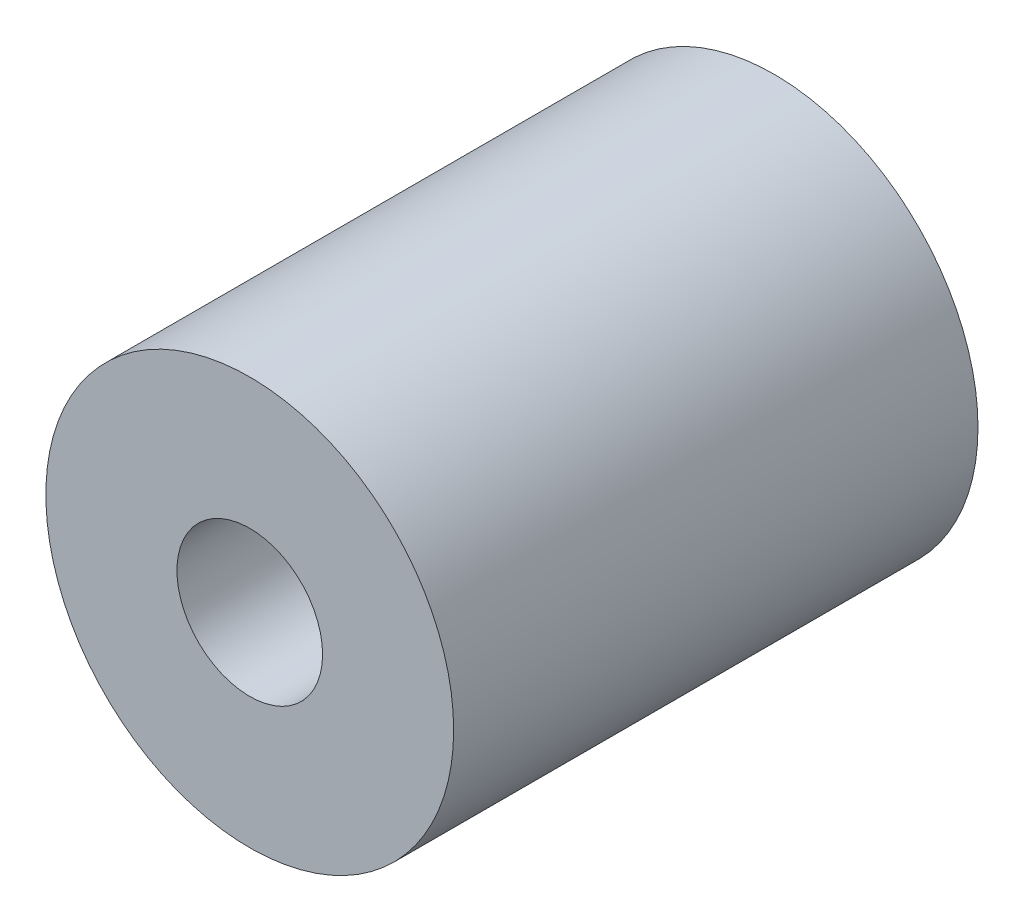
ISO-10303-21;
HEADER;
FILE_DESCRIPTION(('STEP AP214'),'2;1');
FILE_NAME('part.step','',(''),(''),'','','');
FILE_SCHEMA(('AUTOMOTIVE_DESIGN { 1 0 10303 214 1 1 1 1 }'));
ENDSEC;
DATA;
#1=APPLICATION_CONTEXT('core data for automotive mechanical design processes');
#2=APPLICATION_PROTOCOL_DEFINITION('international standard','automotive_design',2000,#1);
#3=PRODUCT_CONTEXT('',#1,'mechanical');
#4=PRODUCT('Part','Part','',(#3));
#5=PRODUCT_RELATED_PRODUCT_CATEGORY('part','',(#4));
#6=PRODUCT_DEFINITION_FORMATION('','',#4);
#7=PRODUCT_DEFINITION_CONTEXT('part definition',#1,'design');
#8=PRODUCT_DEFINITION('design','',#6,#7);
#9=PRODUCT_DEFINITION_SHAPE('','',#8);
#10=(LENGTH_UNIT() NAMED_UNIT(*) SI_UNIT(.MILLI.,.METRE.));
#11=(NAMED_UNIT(*) PLANE_ANGLE_UNIT() SI_UNIT($,.RADIAN.));
#12=(NAMED_UNIT(*) SI_UNIT($,.STERADIAN.) SOLID_ANGLE_UNIT());
#13=UNCERTAINTY_MEASURE_WITH_UNIT(LENGTH_MEASURE(1.E-05),#10,'distance_accuracy_value','');
#14=(GEOMETRIC_REPRESENTATION_CONTEXT(3) GLOBAL_UNCERTAINTY_ASSIGNED_CONTEXT((#13)) GLOBAL_UNIT_ASSIGNED_CONTEXT((#10,
#11,#12)) REPRESENTATION_CONTEXT('',''));
#15=CARTESIAN_POINT('',(0.,0.,0.));
#16=DIRECTION('',(0.,0.,1.));
#17=DIRECTION('',(1.,0.,0.));
#18=AXIS2_PLACEMENT_3D('',#15,#16,#17);
#19=CARTESIAN_POINT('',(0.,0.,0.));
#20=DIRECTION('',(0.,0.,1.));
#21=DIRECTION('',(1.,0.,0.));
#22=AXIS2_PLACEMENT_3D('',#19,#20,#21);
#23=PLANE('',#22);
#24=CARTESIAN_POINT('',(0.,0.,0.));
#25=DIRECTION('',(0.,0.,1.));
#26=DIRECTION('',(1.,0.,0.));
#27=AXIS2_PLACEMENT_3D('',#24,#25,#26);
#28=CIRCLE('',#27,7.);
#29=CARTESIAN_POINT('',(7.,0.,0.));
#30=VERTEX_POINT('',#29);
#31=EDGE_CURVE('E11',#30,#30,#28,.T.);
#32=ORIENTED_EDGE('',*,*,#31,.F.);
#33=EDGE_LOOP('',(#32));
#34=FACE_BOUND('',#33,.T.);
#35=DIRECTION('',(1.,0.,0.));
#36=VECTOR('',#35,1.);
#37=CARTESIAN_POINT('',(-2.28053356329902,-3.95,0.));
#38=LINE('',#37,#36);
#39=CARTESIAN_POINT('',(-2.28053356329902,-3.95,0.));
#40=VERTEX_POINT('',#39);
#41=CARTESIAN_POINT('',(2.28053356329902,-3.95,0.));
#42=VERTEX_POINT('',#41);
#43=EDGE_CURVE('E48',#40,#42,#38,.T.);
#44=ORIENTED_EDGE('',*,*,#43,.T.);
#45=DIRECTION('',(0.5,0.866025403784439,0.));
#46=VECTOR('',#45,1.);
#47=CARTESIAN_POINT('',(2.28053356329902,-3.95,0.));
#48=LINE('',#47,#46);
#49=CARTESIAN_POINT('',(4.56106712659804,0.,0.));
#50=VERTEX_POINT('',#49);
#51=EDGE_CURVE('E107',#42,#50,#48,.T.);
#52=ORIENTED_EDGE('',*,*,#51,.T.);
#53=DIRECTION('',(-0.5,0.866025403784439,0.));
#54=VECTOR('',#53,1.);
#55=CARTESIAN_POINT('',(4.56106712659804,0.,0.));
#56=LINE('',#55,#54);
#57=CARTESIAN_POINT('',(2.28053356329902,3.95,0.));
#58=VERTEX_POINT('',#57);
#59=EDGE_CURVE('E105',#50,#58,#56,.T.);
#60=ORIENTED_EDGE('',*,*,#59,.T.);
#61=DIRECTION('',(-1.,0.,0.));
#62=VECTOR('',#61,1.);
#63=CARTESIAN_POINT('',(2.28053356329902,3.95,0.));
#64=LINE('',#63,#62);
#65=CARTESIAN_POINT('',(-2.28053356329902,3.95,0.));
#66=VERTEX_POINT('',#65);
#67=EDGE_CURVE('E84',#58,#66,#64,.T.);
#68=ORIENTED_EDGE('',*,*,#67,.T.);
#69=DIRECTION('',(-0.5,-0.866025403784439,0.));
#70=VECTOR('',#69,1.);
#71=CARTESIAN_POINT('',(-2.28053356329902,3.95,0.));
#72=LINE('',#71,#70);
#73=CARTESIAN_POINT('',(-4.56106712659804,0.,0.));
#74=VERTEX_POINT('',#73);
#75=EDGE_CURVE('E95',#66,#74,#72,.T.);
#76=ORIENTED_EDGE('',*,*,#75,.T.);
#77=DIRECTION('',(0.5,-0.866025403784439,0.));
#78=VECTOR('',#77,1.);
#79=CARTESIAN_POINT('',(-4.56106712659804,0.,0.));
#80=LINE('',#79,#78);
#81=EDGE_CURVE('E101',#74,#40,#80,.T.);
#82=ORIENTED_EDGE('',*,*,#81,.T.);
#83=EDGE_LOOP('',(#44,#52,#60,#68,#76,#82));
#84=FACE_BOUND('',#83,.T.);
#85=ADVANCED_FACE('F33',(#34,#84),#23,.F.);
#86=CARTESIAN_POINT('',(0.,0.,8.));
#87=DIRECTION('',(0.,0.,-1.));
#88=DIRECTION('',(-1.,0.,0.));
#89=AXIS2_PLACEMENT_3D('',#86,#87,#88);
#90=CYLINDRICAL_SURFACE('',#89,7.);
#91=ORIENTED_EDGE('',*,*,#31,.T.);
#92=EDGE_LOOP('',(#91));
#93=FACE_BOUND('',#92,.T.);
#94=CARTESIAN_POINT('',(0.,0.,18.));
#95=DIRECTION('',(0.,0.,1.));
#96=DIRECTION('',(1.,0.,0.));
#97=AXIS2_PLACEMENT_3D('',#94,#95,#96);
#98=CIRCLE('',#97,7.);
#99=CARTESIAN_POINT('',(7.,0.,18.));
#100=VERTEX_POINT('',#99);
#101=EDGE_CURVE('E122',#100,#100,#98,.T.);
#102=ORIENTED_EDGE('',*,*,#101,.F.);
#103=EDGE_LOOP('',(#102));
#104=FACE_BOUND('',#103,.T.);
#105=ADVANCED_FACE('F35',(#93,#104),#90,.T.);
#106=CARTESIAN_POINT('',(-2.28053356329902,-3.95,8.));
#107=DIRECTION('',(0.,1.,0.));
#108=DIRECTION('',(-1.,0.,0.));
#109=AXIS2_PLACEMENT_3D('',#106,#107,#108);
#110=PLANE('',#109);
#111=ORIENTED_EDGE('',*,*,#43,.F.);
#112=DIRECTION('',(0.,0.,-1.));
#113=VECTOR('',#112,1.);
#114=CARTESIAN_POINT('',(-2.28053356329902,-3.95,8.));
#115=LINE('',#114,#113);
#116=CARTESIAN_POINT('',(-2.28053356329902,-3.95,8.));
#117=VERTEX_POINT('',#116);
#118=EDGE_CURVE('E112',#117,#40,#115,.T.);
#119=ORIENTED_EDGE('',*,*,#118,.F.);
#120=DIRECTION('',(1.,0.,0.));
#121=VECTOR('',#120,1.);
#122=CARTESIAN_POINT('',(-2.28053356329902,-3.95,8.));
#123=LINE('',#122,#121);
#124=CARTESIAN_POINT('',(2.28053356329902,-3.95,8.));
#125=VERTEX_POINT('',#124);
#126=EDGE_CURVE('E57',#117,#125,#123,.T.);
#127=ORIENTED_EDGE('',*,*,#126,.T.);
#128=DIRECTION('',(0.,0.,-1.));
#129=VECTOR('',#128,1.);
#130=CARTESIAN_POINT('',(2.28053356329902,-3.95,8.));
#131=LINE('',#130,#129);
#132=EDGE_CURVE('E41',#125,#42,#131,.T.);
#133=ORIENTED_EDGE('',*,*,#132,.T.);
#134=EDGE_LOOP('',(#111,#119,#127,#133));
#135=FACE_BOUND('',#134,.T.);
#136=ADVANCED_FACE('F119',(#135),#110,.T.);
#137=CARTESIAN_POINT('',(2.28053356329902,-3.95,8.));
#138=DIRECTION('',(-0.866025403784439,0.5,0.));
#139=DIRECTION('',(-0.5,-0.866025403784439,0.));
#140=AXIS2_PLACEMENT_3D('',#137,#138,#139);
#141=PLANE('',#140);
#142=ORIENTED_EDGE('',*,*,#51,.F.);
#143=ORIENTED_EDGE('',*,*,#132,.F.);
#144=DIRECTION('',(0.5,0.866025403784439,0.));
#145=VECTOR('',#144,1.);
#146=CARTESIAN_POINT('',(2.28053356329902,-3.95,8.));
#147=LINE('',#146,#145);
#148=CARTESIAN_POINT('',(4.56106712659804,0.,8.));
#149=VERTEX_POINT('',#148);
#150=EDGE_CURVE('E135',#125,#149,#147,.T.);
#151=ORIENTED_EDGE('',*,*,#150,.T.);
#152=DIRECTION('',(0.,0.,-1.));
#153=VECTOR('',#152,1.);
#154=CARTESIAN_POINT('',(4.56106712659804,0.,8.));
#155=LINE('',#154,#153);
#156=EDGE_CURVE('E117',#149,#50,#155,.T.);
#157=ORIENTED_EDGE('',*,*,#156,.T.);
#158=EDGE_LOOP('',(#142,#143,#151,#157));
#159=FACE_BOUND('',#158,.T.);
#160=ADVANCED_FACE('F171',(#159),#141,.T.);
#161=CARTESIAN_POINT('',(4.56106712659804,0.,8.));
#162=DIRECTION('',(-0.866025403784439,-0.5,0.));
#163=DIRECTION('',(0.5,-0.866025403784439,0.));
#164=AXIS2_PLACEMENT_3D('',#161,#162,#163);
#165=PLANE('',#164);
#166=ORIENTED_EDGE('',*,*,#59,.F.);
#167=ORIENTED_EDGE('',*,*,#156,.F.);
#168=DIRECTION('',(-0.5,0.866025403784439,0.));
#169=VECTOR('',#168,1.);
#170=CARTESIAN_POINT('',(4.56106712659804,0.,8.));
#171=LINE('',#170,#169);
#172=CARTESIAN_POINT('',(2.28053356329902,3.95,8.));
#173=VERTEX_POINT('',#172);
#174=EDGE_CURVE('E132',#149,#173,#171,.T.);
#175=ORIENTED_EDGE('',*,*,#174,.T.);
#176=DIRECTION('',(0.,0.,-1.));
#177=VECTOR('',#176,1.);
#178=CARTESIAN_POINT('',(2.28053356329902,3.95,8.));
#179=LINE('',#178,#177);
#180=EDGE_CURVE('E91',#173,#58,#179,.T.);
#181=ORIENTED_EDGE('',*,*,#180,.T.);
#182=EDGE_LOOP('',(#166,#167,#175,#181));
#183=FACE_BOUND('',#182,.T.);
#184=ADVANCED_FACE('F174',(#183),#165,.T.);
#185=CARTESIAN_POINT('',(2.28053356329902,3.95,8.));
#186=DIRECTION('',(0.,-1.,0.));
#187=DIRECTION('',(1.,0.,0.));
#188=AXIS2_PLACEMENT_3D('',#185,#186,#187);
#189=PLANE('',#188);
#190=ORIENTED_EDGE('',*,*,#67,.F.);
#191=ORIENTED_EDGE('',*,*,#180,.F.);
#192=DIRECTION('',(-1.,0.,0.));
#193=VECTOR('',#192,1.);
#194=CARTESIAN_POINT('',(2.28053356329902,3.95,8.));
#195=LINE('',#194,#193);
#196=CARTESIAN_POINT('',(-2.28053356329902,3.95,8.));
#197=VERTEX_POINT('',#196);
#198=EDGE_CURVE('E88',#173,#197,#195,.T.);
#199=ORIENTED_EDGE('',*,*,#198,.T.);
#200=DIRECTION('',(0.,0.,-1.));
#201=VECTOR('',#200,1.);
#202=CARTESIAN_POINT('',(-2.28053356329902,3.95,8.));
#203=LINE('',#202,#201);
#204=EDGE_CURVE('E79',#197,#66,#203,.T.);
#205=ORIENTED_EDGE('',*,*,#204,.T.);
#206=EDGE_LOOP('',(#190,#191,#199,#205));
#207=FACE_BOUND('',#206,.T.);
#208=ADVANCED_FACE('F81',(#207),#189,.T.);
#209=CARTESIAN_POINT('',(-2.28053356329902,3.95,8.));
#210=DIRECTION('',(0.866025403784439,-0.5,0.));
#211=DIRECTION('',(0.5,0.866025403784439,0.));
#212=AXIS2_PLACEMENT_3D('',#209,#210,#211);
#213=PLANE('',#212);
#214=ORIENTED_EDGE('',*,*,#75,.F.);
#215=ORIENTED_EDGE('',*,*,#204,.F.);
#216=DIRECTION('',(-0.5,-0.866025403784439,0.));
#217=VECTOR('',#216,1.);
#218=CARTESIAN_POINT('',(-2.28053356329902,3.95,8.));
#219=LINE('',#218,#217);
#220=CARTESIAN_POINT('',(-4.56106712659804,0.,8.));
#221=VERTEX_POINT('',#220);
#222=EDGE_CURVE('E129',#197,#221,#219,.T.);
#223=ORIENTED_EDGE('',*,*,#222,.T.);
#224=DIRECTION('',(0.,0.,-1.));
#225=VECTOR('',#224,1.);
#226=CARTESIAN_POINT('',(-4.56106712659804,0.,8.));
#227=LINE('',#226,#225);
#228=EDGE_CURVE('E92',#221,#74,#227,.T.);
#229=ORIENTED_EDGE('',*,*,#228,.T.);
#230=EDGE_LOOP('',(#214,#215,#223,#229));
#231=FACE_BOUND('',#230,.T.);
#232=ADVANCED_FACE('F96',(#231),#213,.T.);
#233=CARTESIAN_POINT('',(-4.56106712659804,0.,8.));
#234=DIRECTION('',(0.866025403784439,0.5,0.));
#235=DIRECTION('',(-0.5,0.866025403784439,0.));
#236=AXIS2_PLACEMENT_3D('',#233,#234,#235);
#237=PLANE('',#236);
#238=ORIENTED_EDGE('',*,*,#81,.F.);
#239=ORIENTED_EDGE('',*,*,#228,.F.);
#240=DIRECTION('',(0.5,-0.866025403784439,0.));
#241=VECTOR('',#240,1.);
#242=CARTESIAN_POINT('',(-4.56106712659804,0.,8.));
#243=LINE('',#242,#241);
#244=EDGE_CURVE('E114',#221,#117,#243,.T.);
#245=ORIENTED_EDGE('',*,*,#244,.T.);
#246=ORIENTED_EDGE('',*,*,#118,.T.);
#247=EDGE_LOOP('',(#238,#239,#245,#246));
#248=FACE_BOUND('',#247,.T.);
#249=ADVANCED_FACE('F150',(#248),#237,.T.);
#250=CARTESIAN_POINT('',(0.,0.,18.));
#251=DIRECTION('',(0.,0.,1.));
#252=DIRECTION('',(1.,0.,0.));
#253=AXIS2_PLACEMENT_3D('',#250,#251,#252);
#254=PLANE('',#253);
#255=ORIENTED_EDGE('',*,*,#101,.T.);
#256=EDGE_LOOP('',(#255));
#257=FACE_BOUND('',#256,.T.);
#258=CARTESIAN_POINT('',(0.,0.,18.));
#259=DIRECTION('',(0.,0.,1.));
#260=DIRECTION('',(1.,0.,0.));
#261=AXIS2_PLACEMENT_3D('',#258,#259,#260);
#262=CIRCLE('',#261,2.5);
#263=CARTESIAN_POINT('',(2.5,0.,18.));
#264=VERTEX_POINT('',#263);
#265=EDGE_CURVE('E125',#264,#264,#262,.T.);
#266=ORIENTED_EDGE('',*,*,#265,.F.);
#267=EDGE_LOOP('',(#266));
#268=FACE_BOUND('',#267,.T.);
#269=ADVANCED_FACE('F147',(#257,#268),#254,.T.);
#270=CARTESIAN_POINT('',(0.,0.,8.));
#271=DIRECTION('',(0.,0.,1.));
#272=DIRECTION('',(1.,0.,0.));
#273=AXIS2_PLACEMENT_3D('',#270,#271,#272);
#274=PLANE('',#273);
#275=ORIENTED_EDGE('',*,*,#126,.F.);
#276=ORIENTED_EDGE('',*,*,#244,.F.);
#277=ORIENTED_EDGE('',*,*,#222,.F.);
#278=ORIENTED_EDGE('',*,*,#198,.F.);
#279=ORIENTED_EDGE('',*,*,#174,.F.);
#280=ORIENTED_EDGE('',*,*,#150,.F.);
#281=EDGE_LOOP('',(#275,#276,#277,#278,#279,#280));
#282=FACE_BOUND('',#281,.T.);
#283=CARTESIAN_POINT('',(0.,0.,8.));
#284=DIRECTION('',(0.,0.,1.));
#285=DIRECTION('',(1.,0.,0.));
#286=AXIS2_PLACEMENT_3D('',#283,#284,#285);
#287=CIRCLE('',#286,2.5);
#288=CARTESIAN_POINT('',(2.5,0.,8.));
#289=VERTEX_POINT('',#288);
#290=EDGE_CURVE('E138',#289,#289,#287,.T.);
#291=ORIENTED_EDGE('',*,*,#290,.T.);
#292=EDGE_LOOP('',(#291));
#293=FACE_BOUND('',#292,.T.);
#294=ADVANCED_FACE('F149',(#282,#293),#274,.F.);
#295=CARTESIAN_POINT('',(0.,0.,18.));
#296=DIRECTION('',(0.,0.,-1.));
#297=DIRECTION('',(-1.,0.,0.));
#298=AXIS2_PLACEMENT_3D('',#295,#296,#297);
#299=CYLINDRICAL_SURFACE('',#298,2.5);
#300=ORIENTED_EDGE('',*,*,#265,.T.);
#301=EDGE_LOOP('',(#300));
#302=FACE_BOUND('',#301,.T.);
#303=ORIENTED_EDGE('',*,*,#290,.F.);
#304=EDGE_LOOP('',(#303));
#305=FACE_BOUND('',#304,.T.);
#306=ADVANCED_FACE('F144',(#302,#305),#299,.F.);
#307=CLOSED_SHELL('',(#85,#105,#136,#160,#184,#208,#232,#249,#269,#294,#306));
#308=MANIFOLD_SOLID_BREP('B2',#307);
#309=ADVANCED_BREP_SHAPE_REPRESENTATION('',(#18,#308),#14);
#310=SHAPE_DEFINITION_REPRESENTATION(#9,#309);
ENDSEC;
END-ISO-10303-21;
